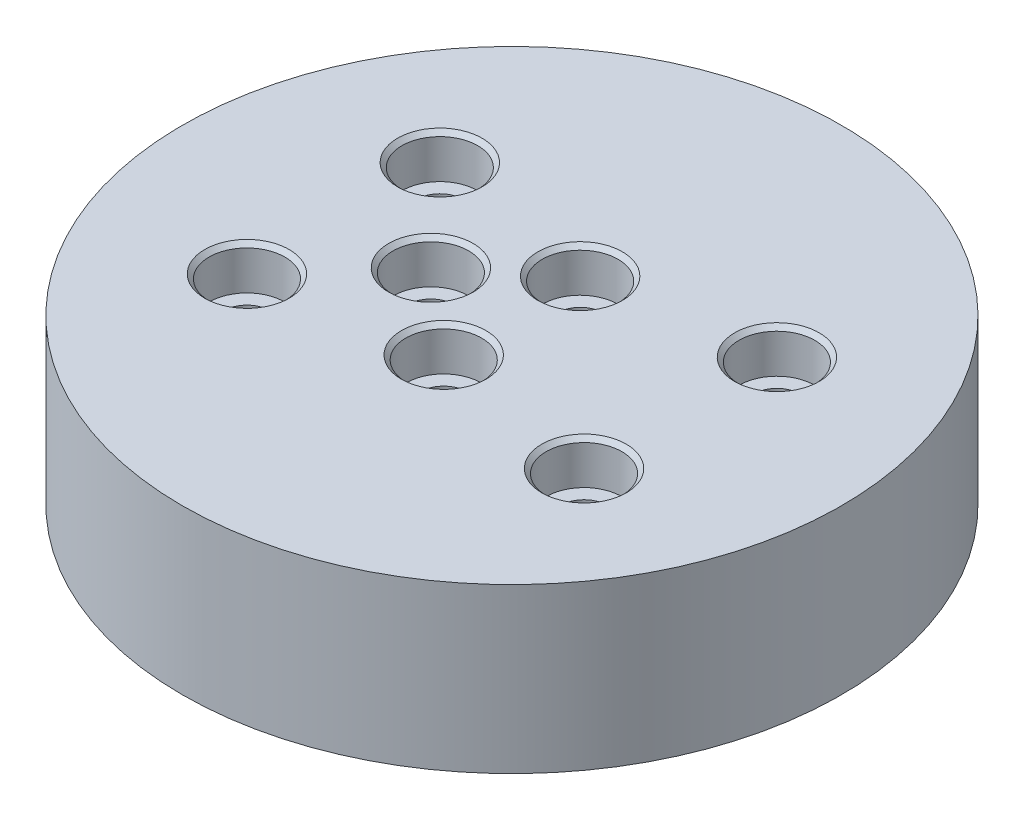
ISO-10303-21;
HEADER;
FILE_DESCRIPTION(('STEP AP214'),'2;1');
FILE_NAME('part.step','',(''),(''),'','','');
FILE_SCHEMA(('AUTOMOTIVE_DESIGN { 1 0 10303 214 1 1 1 1 }'));
ENDSEC;
DATA;
#1=APPLICATION_CONTEXT('core data for automotive mechanical design processes');
#2=APPLICATION_PROTOCOL_DEFINITION('international standard','automotive_design',2000,#1);
#3=PRODUCT_CONTEXT('',#1,'mechanical');
#4=PRODUCT('Part','Part','',(#3));
#5=PRODUCT_RELATED_PRODUCT_CATEGORY('part','',(#4));
#6=PRODUCT_DEFINITION_FORMATION('','',#4);
#7=PRODUCT_DEFINITION_CONTEXT('part definition',#1,'design');
#8=PRODUCT_DEFINITION('design','',#6,#7);
#9=PRODUCT_DEFINITION_SHAPE('','',#8);
#10=(LENGTH_UNIT() NAMED_UNIT(*) SI_UNIT(.MILLI.,.METRE.));
#11=(NAMED_UNIT(*) PLANE_ANGLE_UNIT() SI_UNIT($,.RADIAN.));
#12=(NAMED_UNIT(*) SI_UNIT($,.STERADIAN.) SOLID_ANGLE_UNIT());
#13=UNCERTAINTY_MEASURE_WITH_UNIT(LENGTH_MEASURE(1.E-05),#10,'distance_accuracy_value','');
#14=(GEOMETRIC_REPRESENTATION_CONTEXT(3) GLOBAL_UNCERTAINTY_ASSIGNED_CONTEXT((#13)) GLOBAL_UNIT_ASSIGNED_CONTEXT((#10,
#11,#12)) REPRESENTATION_CONTEXT('',''));
#15=CARTESIAN_POINT('',(0.,0.,0.));
#16=DIRECTION('',(0.,0.,1.));
#17=DIRECTION('',(1.,0.,0.));
#18=AXIS2_PLACEMENT_3D('',#15,#16,#17);
#19=CARTESIAN_POINT('',(0.,24.,0.));
#20=DIRECTION('',(0.,-1.,0.));
#21=DIRECTION('',(0.,0.,-1.));
#22=AXIS2_PLACEMENT_3D('',#19,#20,#21);
#23=CYLINDRICAL_SURFACE('',#22,48.3128047327164);
#24=CARTESIAN_POINT('',(0.,24.,0.));
#25=DIRECTION('',(0.,1.,0.));
#26=DIRECTION('',(0.,0.,1.));
#27=AXIS2_PLACEMENT_3D('',#24,#25,#26);
#28=CIRCLE('',#27,48.3128047327164);
#29=CARTESIAN_POINT('',(0.,24.,48.3128047327164));
#30=VERTEX_POINT('',#29);
#31=EDGE_CURVE('E10',#30,#30,#28,.T.);
#32=ORIENTED_EDGE('',*,*,#31,.F.);
#33=EDGE_LOOP('',(#32));
#34=FACE_BOUND('',#33,.T.);
#35=CARTESIAN_POINT('',(0.,0.,0.));
#36=DIRECTION('',(0.,1.,0.));
#37=DIRECTION('',(0.,0.,1.));
#38=AXIS2_PLACEMENT_3D('',#35,#36,#37);
#39=CIRCLE('',#38,48.3128047327164);
#40=CARTESIAN_POINT('',(0.,0.,48.3128047327164));
#41=VERTEX_POINT('',#40);
#42=EDGE_CURVE('E34',#41,#41,#39,.T.);
#43=ORIENTED_EDGE('',*,*,#42,.T.);
#44=EDGE_LOOP('',(#43));
#45=FACE_BOUND('',#44,.T.);
#46=ADVANCED_FACE('F31',(#34,#45),#23,.T.);
#47=CARTESIAN_POINT('',(0.,24.,0.));
#48=DIRECTION('',(0.,1.,0.));
#49=DIRECTION('',(0.,0.,1.));
#50=AXIS2_PLACEMENT_3D('',#47,#48,#49);
#51=PLANE('',#50);
#52=CARTESIAN_POINT('',(0.,24.,10.));
#53=DIRECTION('',(0.,1.,0.));
#54=DIRECTION('',(0.,0.,1.));
#55=AXIS2_PLACEMENT_3D('',#52,#53,#54);
#56=CIRCLE('',#55,6.19125);
#57=CARTESIAN_POINT('',(0.,24.,16.19125));
#58=VERTEX_POINT('',#57);
#59=EDGE_CURVE('E144',#58,#58,#56,.T.);
#60=ORIENTED_EDGE('',*,*,#59,.F.);
#61=EDGE_LOOP('',(#60));
#62=FACE_BOUND('',#61,.T.);
#63=CARTESIAN_POINT('',(-24.7068324205673,24.,14.1367177629493));
#64=DIRECTION('',(0.,1.,0.));
#65=DIRECTION('',(0.,0.,1.));
#66=AXIS2_PLACEMENT_3D('',#63,#64,#65);
#67=CIRCLE('',#66,6.19125);
#68=CARTESIAN_POINT('',(-24.7068324205673,24.,20.3279677629493));
#69=VERTEX_POINT('',#68);
#70=EDGE_CURVE('E129',#69,#69,#67,.T.);
#71=ORIENTED_EDGE('',*,*,#70,.F.);
#72=EDGE_LOOP('',(#71));
#73=FACE_BOUND('',#72,.T.);
#74=CARTESIAN_POINT('',(-24.7068324205673,24.,-14.1367177629493));
#75=DIRECTION('',(0.,1.,0.));
#76=DIRECTION('',(0.,0.,1.));
#77=AXIS2_PLACEMENT_3D('',#74,#75,#76);
#78=CIRCLE('',#77,6.19125);
#79=CARTESIAN_POINT('',(-24.7068324205673,24.,-7.94546776294935));
#80=VERTEX_POINT('',#79);
#81=EDGE_CURVE('E114',#80,#80,#78,.T.);
#82=ORIENTED_EDGE('',*,*,#81,.F.);
#83=EDGE_LOOP('',(#82));
#84=FACE_BOUND('',#83,.T.);
#85=CARTESIAN_POINT('',(24.7068324205673,24.,-14.1367177629493));
#86=DIRECTION('',(0.,1.,0.));
#87=DIRECTION('',(0.,0.,1.));
#88=AXIS2_PLACEMENT_3D('',#85,#86,#87);
#89=CIRCLE('',#88,6.19125);
#90=CARTESIAN_POINT('',(24.7068324205673,24.,-7.94546776294935));
#91=VERTEX_POINT('',#90);
#92=EDGE_CURVE('E99',#91,#91,#89,.T.);
#93=ORIENTED_EDGE('',*,*,#92,.F.);
#94=EDGE_LOOP('',(#93));
#95=FACE_BOUND('',#94,.T.);
#96=CARTESIAN_POINT('',(0.,24.,-10.));
#97=DIRECTION('',(0.,1.,0.));
#98=DIRECTION('',(0.,0.,1.));
#99=AXIS2_PLACEMENT_3D('',#96,#97,#98);
#100=CIRCLE('',#99,6.19125);
#101=CARTESIAN_POINT('',(0.,24.,-3.80875));
#102=VERTEX_POINT('',#101);
#103=EDGE_CURVE('E84',#102,#102,#100,.T.);
#104=ORIENTED_EDGE('',*,*,#103,.F.);
#105=EDGE_LOOP('',(#104));
#106=FACE_BOUND('',#105,.T.);
#107=CARTESIAN_POINT('',(24.7068324205673,24.,14.1367177629493));
#108=DIRECTION('',(0.,1.,0.));
#109=DIRECTION('',(0.,0.,1.));
#110=AXIS2_PLACEMENT_3D('',#107,#108,#109);
#111=CIRCLE('',#110,6.19125);
#112=CARTESIAN_POINT('',(24.7068324205673,24.,20.3279677629493));
#113=VERTEX_POINT('',#112);
#114=EDGE_CURVE('E69',#113,#113,#111,.T.);
#115=ORIENTED_EDGE('',*,*,#114,.F.);
#116=EDGE_LOOP('',(#115));
#117=FACE_BOUND('',#116,.T.);
#118=CARTESIAN_POINT('',(-12.,24.,-0.121142117749606));
#119=DIRECTION('',(0.,1.,0.));
#120=DIRECTION('',(0.,0.,1.));
#121=AXIS2_PLACEMENT_3D('',#118,#119,#120);
#122=CIRCLE('',#121,6.19125);
#123=CARTESIAN_POINT('',(-12.,24.,6.07010788225039));
#124=VERTEX_POINT('',#123);
#125=EDGE_CURVE('E54',#124,#124,#122,.T.);
#126=ORIENTED_EDGE('',*,*,#125,.F.);
#127=EDGE_LOOP('',(#126));
#128=FACE_BOUND('',#127,.T.);
#129=ORIENTED_EDGE('',*,*,#31,.T.);
#130=EDGE_LOOP('',(#129));
#131=FACE_BOUND('',#130,.T.);
#132=ADVANCED_FACE('F150',(#62,#73,#84,#95,#106,#117,#128,#131),#51,.T.);
#133=CARTESIAN_POINT('',(0.,0.,0.));
#134=DIRECTION('',(0.,1.,0.));
#135=DIRECTION('',(0.,0.,1.));
#136=AXIS2_PLACEMENT_3D('',#133,#134,#135);
#137=PLANE('',#136);
#138=CARTESIAN_POINT('',(0.,0.,10.));
#139=DIRECTION('',(0.,1.,0.));
#140=DIRECTION('',(0.,0.,1.));
#141=AXIS2_PLACEMENT_3D('',#138,#139,#140);
#142=CIRCLE('',#141,3.3782);
#143=CARTESIAN_POINT('',(0.,0.,13.3782));
#144=VERTEX_POINT('',#143);
#145=EDGE_CURVE('E132',#144,#144,#142,.T.);
#146=ORIENTED_EDGE('',*,*,#145,.T.);
#147=EDGE_LOOP('',(#146));
#148=FACE_BOUND('',#147,.T.);
#149=CARTESIAN_POINT('',(-24.7068324205673,0.,14.1367177629493));
#150=DIRECTION('',(0.,1.,0.));
#151=DIRECTION('',(0.,0.,1.));
#152=AXIS2_PLACEMENT_3D('',#149,#150,#151);
#153=CIRCLE('',#152,3.3782);
#154=CARTESIAN_POINT('',(-24.7068324205673,0.,17.5149177629493));
#155=VERTEX_POINT('',#154);
#156=EDGE_CURVE('E117',#155,#155,#153,.T.);
#157=ORIENTED_EDGE('',*,*,#156,.T.);
#158=EDGE_LOOP('',(#157));
#159=FACE_BOUND('',#158,.T.);
#160=CARTESIAN_POINT('',(-24.7068324205673,0.,-14.1367177629493));
#161=DIRECTION('',(0.,1.,0.));
#162=DIRECTION('',(0.,0.,1.));
#163=AXIS2_PLACEMENT_3D('',#160,#161,#162);
#164=CIRCLE('',#163,3.3782);
#165=CARTESIAN_POINT('',(-24.7068324205673,0.,-10.7585177629494));
#166=VERTEX_POINT('',#165);
#167=EDGE_CURVE('E102',#166,#166,#164,.T.);
#168=ORIENTED_EDGE('',*,*,#167,.T.);
#169=EDGE_LOOP('',(#168));
#170=FACE_BOUND('',#169,.T.);
#171=CARTESIAN_POINT('',(24.7068324205673,0.,-14.1367177629493));
#172=DIRECTION('',(0.,1.,0.));
#173=DIRECTION('',(0.,0.,1.));
#174=AXIS2_PLACEMENT_3D('',#171,#172,#173);
#175=CIRCLE('',#174,3.3782);
#176=CARTESIAN_POINT('',(24.7068324205673,0.,-10.7585177629494));
#177=VERTEX_POINT('',#176);
#178=EDGE_CURVE('E87',#177,#177,#175,.T.);
#179=ORIENTED_EDGE('',*,*,#178,.T.);
#180=EDGE_LOOP('',(#179));
#181=FACE_BOUND('',#180,.T.);
#182=CARTESIAN_POINT('',(0.,0.,-10.));
#183=DIRECTION('',(0.,1.,0.));
#184=DIRECTION('',(0.,0.,1.));
#185=AXIS2_PLACEMENT_3D('',#182,#183,#184);
#186=CIRCLE('',#185,3.3782);
#187=CARTESIAN_POINT('',(0.,0.,-6.62180000000001));
#188=VERTEX_POINT('',#187);
#189=EDGE_CURVE('E72',#188,#188,#186,.T.);
#190=ORIENTED_EDGE('',*,*,#189,.T.);
#191=EDGE_LOOP('',(#190));
#192=FACE_BOUND('',#191,.T.);
#193=CARTESIAN_POINT('',(24.7068324205673,0.,14.1367177629493));
#194=DIRECTION('',(0.,1.,0.));
#195=DIRECTION('',(0.,0.,1.));
#196=AXIS2_PLACEMENT_3D('',#193,#194,#195);
#197=CIRCLE('',#196,3.3782);
#198=CARTESIAN_POINT('',(24.7068324205673,0.,17.5149177629493));
#199=VERTEX_POINT('',#198);
#200=EDGE_CURVE('E57',#199,#199,#197,.T.);
#201=ORIENTED_EDGE('',*,*,#200,.T.);
#202=EDGE_LOOP('',(#201));
#203=FACE_BOUND('',#202,.T.);
#204=CARTESIAN_POINT('',(-12.,0.,-0.121142117749606));
#205=DIRECTION('',(0.,1.,0.));
#206=DIRECTION('',(0.,0.,1.));
#207=AXIS2_PLACEMENT_3D('',#204,#205,#206);
#208=CIRCLE('',#207,3.3782);
#209=CARTESIAN_POINT('',(-12.,0.,3.25705788225039));
#210=VERTEX_POINT('',#209);
#211=EDGE_CURVE('E41',#210,#210,#208,.T.);
#212=ORIENTED_EDGE('',*,*,#211,.T.);
#213=EDGE_LOOP('',(#212));
#214=FACE_BOUND('',#213,.T.);
#215=ORIENTED_EDGE('',*,*,#42,.F.);
#216=EDGE_LOOP('',(#215));
#217=FACE_BOUND('',#216,.T.);
#218=ADVANCED_FACE('F153',(#148,#159,#170,#181,#192,#203,#214,#217),#137,.F.);
#219=CARTESIAN_POINT('',(-12.,24.,-0.121142117749606));
#220=DIRECTION('',(0.,1.,0.));
#221=DIRECTION('',(0.,0.,1.));
#222=AXIS2_PLACEMENT_3D('',#219,#220,#221);
#223=CYLINDRICAL_SURFACE('',#222,3.3782);
#224=ORIENTED_EDGE('',*,*,#211,.F.);
#225=EDGE_LOOP('',(#224));
#226=FACE_BOUND('',#225,.T.);
#227=CARTESIAN_POINT('',(-12.,17.65,-0.121142117749606));
#228=DIRECTION('',(0.,1.,0.));
#229=DIRECTION('',(0.,0.,1.));
#230=AXIS2_PLACEMENT_3D('',#227,#228,#229);
#231=CIRCLE('',#230,3.3782);
#232=CARTESIAN_POINT('',(-12.,17.65,3.25705788225039));
#233=VERTEX_POINT('',#232);
#234=EDGE_CURVE('E45',#233,#233,#231,.T.);
#235=ORIENTED_EDGE('',*,*,#234,.T.);
#236=EDGE_LOOP('',(#235));
#237=FACE_BOUND('',#236,.T.);
#238=ADVANCED_FACE('F193',(#226,#237),#223,.F.);
#239=CARTESIAN_POINT('',(-6.44375,17.65,-0.121142117749606));
#240=DIRECTION('',(0.,-1.,0.));
#241=DIRECTION('',(0.,0.,-1.));
#242=AXIS2_PLACEMENT_3D('',#239,#240,#241);
#243=PLANE('',#242);
#244=ORIENTED_EDGE('',*,*,#234,.F.);
#245=EDGE_LOOP('',(#244));
#246=FACE_BOUND('',#245,.T.);
#247=CARTESIAN_POINT('',(-12.,17.65,-0.121142117749606));
#248=DIRECTION('',(0.,1.,0.));
#249=DIRECTION('',(0.,0.,1.));
#250=AXIS2_PLACEMENT_3D('',#247,#248,#249);
#251=CIRCLE('',#250,5.55625);
#252=CARTESIAN_POINT('',(-12.,17.65,5.43510788225039));
#253=VERTEX_POINT('',#252);
#254=EDGE_CURVE('E48',#253,#253,#251,.T.);
#255=ORIENTED_EDGE('',*,*,#254,.T.);
#256=EDGE_LOOP('',(#255));
#257=FACE_BOUND('',#256,.T.);
#258=ADVANCED_FACE('F180',(#246,#257),#243,.F.);
#259=CARTESIAN_POINT('',(-12.,24.,-0.121142117749606));
#260=DIRECTION('',(0.,1.,0.));
#261=DIRECTION('',(0.,0.,1.));
#262=AXIS2_PLACEMENT_3D('',#259,#260,#261);
#263=CYLINDRICAL_SURFACE('',#262,5.55625);
#264=ORIENTED_EDGE('',*,*,#254,.F.);
#265=EDGE_LOOP('',(#264));
#266=FACE_BOUND('',#265,.T.);
#267=CARTESIAN_POINT('',(-12.,23.365,-0.121142117749606));
#268=DIRECTION('',(0.,1.,0.));
#269=DIRECTION('',(0.,0.,1.));
#270=AXIS2_PLACEMENT_3D('',#267,#268,#269);
#271=CIRCLE('',#270,5.55625);
#272=CARTESIAN_POINT('',(-12.,23.365,5.43510788225039));
#273=VERTEX_POINT('',#272);
#274=EDGE_CURVE('E51',#273,#273,#271,.T.);
#275=ORIENTED_EDGE('',*,*,#274,.T.);
#276=EDGE_LOOP('',(#275));
#277=FACE_BOUND('',#276,.T.);
#278=ADVANCED_FACE('F170',(#266,#277),#263,.F.);
#279=CARTESIAN_POINT('',(-12.,24.,-0.121142117749606));
#280=DIRECTION('',(0.,1.,0.));
#281=DIRECTION('',(0.,0.,1.));
#282=AXIS2_PLACEMENT_3D('',#279,#280,#281);
#283=CONICAL_SURFACE('',#282,6.19125,0.785398163397448);
#284=ORIENTED_EDGE('',*,*,#274,.F.);
#285=EDGE_LOOP('',(#284));
#286=FACE_BOUND('',#285,.T.);
#287=ORIENTED_EDGE('',*,*,#125,.T.);
#288=EDGE_LOOP('',(#287));
#289=FACE_BOUND('',#288,.T.);
#290=ADVANCED_FACE('F167',(#286,#289),#283,.F.);
#291=CARTESIAN_POINT('',(24.7068324205673,24.,14.1367177629493));
#292=DIRECTION('',(0.,1.,0.));
#293=DIRECTION('',(0.,0.,1.));
#294=AXIS2_PLACEMENT_3D('',#291,#292,#293);
#295=CYLINDRICAL_SURFACE('',#294,3.3782);
#296=ORIENTED_EDGE('',*,*,#200,.F.);
#297=EDGE_LOOP('',(#296));
#298=FACE_BOUND('',#297,.T.);
#299=CARTESIAN_POINT('',(24.7068324205673,17.65,14.1367177629493));
#300=DIRECTION('',(0.,1.,0.));
#301=DIRECTION('',(0.,0.,1.));
#302=AXIS2_PLACEMENT_3D('',#299,#300,#301);
#303=CIRCLE('',#302,3.3782);
#304=CARTESIAN_POINT('',(24.7068324205673,17.65,17.5149177629493));
#305=VERTEX_POINT('',#304);
#306=EDGE_CURVE('E60',#305,#305,#303,.T.);
#307=ORIENTED_EDGE('',*,*,#306,.T.);
#308=EDGE_LOOP('',(#307));
#309=FACE_BOUND('',#308,.T.);
#310=ADVANCED_FACE('F169',(#298,#309),#295,.F.);
#311=CARTESIAN_POINT('',(30.2630824205673,17.65,14.1367177629493));
#312=DIRECTION('',(0.,-1.,0.));
#313=DIRECTION('',(0.,0.,-1.));
#314=AXIS2_PLACEMENT_3D('',#311,#312,#313);
#315=PLANE('',#314);
#316=ORIENTED_EDGE('',*,*,#306,.F.);
#317=EDGE_LOOP('',(#316));
#318=FACE_BOUND('',#317,.T.);
#319=CARTESIAN_POINT('',(24.7068324205673,17.65,14.1367177629493));
#320=DIRECTION('',(0.,1.,0.));
#321=DIRECTION('',(0.,0.,1.));
#322=AXIS2_PLACEMENT_3D('',#319,#320,#321);
#323=CIRCLE('',#322,5.55625);
#324=CARTESIAN_POINT('',(24.7068324205673,17.65,19.6929677629493));
#325=VERTEX_POINT('',#324);
#326=EDGE_CURVE('E63',#325,#325,#323,.T.);
#327=ORIENTED_EDGE('',*,*,#326,.T.);
#328=EDGE_LOOP('',(#327));
#329=FACE_BOUND('',#328,.T.);
#330=ADVANCED_FACE('F177',(#318,#329),#315,.F.);
#331=CARTESIAN_POINT('',(24.7068324205673,24.,14.1367177629493));
#332=DIRECTION('',(0.,1.,0.));
#333=DIRECTION('',(0.,0.,1.));
#334=AXIS2_PLACEMENT_3D('',#331,#332,#333);
#335=CYLINDRICAL_SURFACE('',#334,5.55625);
#336=ORIENTED_EDGE('',*,*,#326,.F.);
#337=EDGE_LOOP('',(#336));
#338=FACE_BOUND('',#337,.T.);
#339=CARTESIAN_POINT('',(24.7068324205673,23.365,14.1367177629493));
#340=DIRECTION('',(0.,1.,0.));
#341=DIRECTION('',(0.,0.,1.));
#342=AXIS2_PLACEMENT_3D('',#339,#340,#341);
#343=CIRCLE('',#342,5.55625);
#344=CARTESIAN_POINT('',(24.7068324205673,23.365,19.6929677629493));
#345=VERTEX_POINT('',#344);
#346=EDGE_CURVE('E66',#345,#345,#343,.T.);
#347=ORIENTED_EDGE('',*,*,#346,.T.);
#348=EDGE_LOOP('',(#347));
#349=FACE_BOUND('',#348,.T.);
#350=ADVANCED_FACE('F236',(#338,#349),#335,.F.);
#351=CARTESIAN_POINT('',(24.7068324205673,24.,14.1367177629493));
#352=DIRECTION('',(0.,1.,0.));
#353=DIRECTION('',(0.,0.,1.));
#354=AXIS2_PLACEMENT_3D('',#351,#352,#353);
#355=CONICAL_SURFACE('',#354,6.19125,0.785398163397448);
#356=ORIENTED_EDGE('',*,*,#346,.F.);
#357=EDGE_LOOP('',(#356));
#358=FACE_BOUND('',#357,.T.);
#359=ORIENTED_EDGE('',*,*,#114,.T.);
#360=EDGE_LOOP('',(#359));
#361=FACE_BOUND('',#360,.T.);
#362=ADVANCED_FACE('F246',(#358,#361),#355,.F.);
#363=CARTESIAN_POINT('',(0.,24.,-10.));
#364=DIRECTION('',(0.,1.,0.));
#365=DIRECTION('',(0.,0.,1.));
#366=AXIS2_PLACEMENT_3D('',#363,#364,#365);
#367=CYLINDRICAL_SURFACE('',#366,3.3782);
#368=ORIENTED_EDGE('',*,*,#189,.F.);
#369=EDGE_LOOP('',(#368));
#370=FACE_BOUND('',#369,.T.);
#371=CARTESIAN_POINT('',(0.,17.65,-10.));
#372=DIRECTION('',(0.,1.,0.));
#373=DIRECTION('',(0.,0.,1.));
#374=AXIS2_PLACEMENT_3D('',#371,#372,#373);
#375=CIRCLE('',#374,3.3782);
#376=CARTESIAN_POINT('',(0.,17.65,-6.6218));
#377=VERTEX_POINT('',#376);
#378=EDGE_CURVE('E75',#377,#377,#375,.T.);
#379=ORIENTED_EDGE('',*,*,#378,.T.);
#380=EDGE_LOOP('',(#379));
#381=FACE_BOUND('',#380,.T.);
#382=ADVANCED_FACE('F256',(#370,#381),#367,.F.);
#383=CARTESIAN_POINT('',(5.55625,17.65,-10.));
#384=DIRECTION('',(0.,-1.,0.));
#385=DIRECTION('',(0.,0.,-1.));
#386=AXIS2_PLACEMENT_3D('',#383,#384,#385);
#387=PLANE('',#386);
#388=ORIENTED_EDGE('',*,*,#378,.F.);
#389=EDGE_LOOP('',(#388));
#390=FACE_BOUND('',#389,.T.);
#391=CARTESIAN_POINT('',(0.,17.65,-10.));
#392=DIRECTION('',(0.,1.,0.));
#393=DIRECTION('',(0.,0.,1.));
#394=AXIS2_PLACEMENT_3D('',#391,#392,#393);
#395=CIRCLE('',#394,5.55625);
#396=CARTESIAN_POINT('',(0.,17.65,-4.44375));
#397=VERTEX_POINT('',#396);
#398=EDGE_CURVE('E78',#397,#397,#395,.T.);
#399=ORIENTED_EDGE('',*,*,#398,.T.);
#400=EDGE_LOOP('',(#399));
#401=FACE_BOUND('',#400,.T.);
#402=ADVANCED_FACE('F266',(#390,#401),#387,.F.);
#403=CARTESIAN_POINT('',(0.,24.,-10.));
#404=DIRECTION('',(0.,1.,0.));
#405=DIRECTION('',(0.,0.,1.));
#406=AXIS2_PLACEMENT_3D('',#403,#404,#405);
#407=CYLINDRICAL_SURFACE('',#406,5.55625);
#408=ORIENTED_EDGE('',*,*,#398,.F.);
#409=EDGE_LOOP('',(#408));
#410=FACE_BOUND('',#409,.T.);
#411=CARTESIAN_POINT('',(0.,23.365,-10.));
#412=DIRECTION('',(0.,1.,0.));
#413=DIRECTION('',(0.,0.,1.));
#414=AXIS2_PLACEMENT_3D('',#411,#412,#413);
#415=CIRCLE('',#414,5.55625);
#416=CARTESIAN_POINT('',(0.,23.365,-4.44375));
#417=VERTEX_POINT('',#416);
#418=EDGE_CURVE('E81',#417,#417,#415,.T.);
#419=ORIENTED_EDGE('',*,*,#418,.T.);
#420=EDGE_LOOP('',(#419));
#421=FACE_BOUND('',#420,.T.);
#422=ADVANCED_FACE('F276',(#410,#421),#407,.F.);
#423=CARTESIAN_POINT('',(0.,24.,-10.));
#424=DIRECTION('',(0.,1.,0.));
#425=DIRECTION('',(0.,0.,1.));
#426=AXIS2_PLACEMENT_3D('',#423,#424,#425);
#427=CONICAL_SURFACE('',#426,6.19125,0.785398163397448);
#428=ORIENTED_EDGE('',*,*,#418,.F.);
#429=EDGE_LOOP('',(#428));
#430=FACE_BOUND('',#429,.T.);
#431=ORIENTED_EDGE('',*,*,#103,.T.);
#432=EDGE_LOOP('',(#431));
#433=FACE_BOUND('',#432,.T.);
#434=ADVANCED_FACE('F286',(#430,#433),#427,.F.);
#435=CARTESIAN_POINT('',(24.7068324205673,24.,-14.1367177629493));
#436=DIRECTION('',(0.,1.,0.));
#437=DIRECTION('',(0.,0.,1.));
#438=AXIS2_PLACEMENT_3D('',#435,#436,#437);
#439=CYLINDRICAL_SURFACE('',#438,3.3782);
#440=ORIENTED_EDGE('',*,*,#178,.F.);
#441=EDGE_LOOP('',(#440));
#442=FACE_BOUND('',#441,.T.);
#443=CARTESIAN_POINT('',(24.7068324205673,17.65,-14.1367177629493));
#444=DIRECTION('',(0.,1.,0.));
#445=DIRECTION('',(0.,0.,1.));
#446=AXIS2_PLACEMENT_3D('',#443,#444,#445);
#447=CIRCLE('',#446,3.3782);
#448=CARTESIAN_POINT('',(24.7068324205673,17.65,-10.7585177629494));
#449=VERTEX_POINT('',#448);
#450=EDGE_CURVE('E90',#449,#449,#447,.T.);
#451=ORIENTED_EDGE('',*,*,#450,.T.);
#452=EDGE_LOOP('',(#451));
#453=FACE_BOUND('',#452,.T.);
#454=ADVANCED_FACE('F296',(#442,#453),#439,.F.);
#455=CARTESIAN_POINT('',(30.2630824205673,17.65,-14.1367177629493));
#456=DIRECTION('',(0.,-1.,0.));
#457=DIRECTION('',(0.,0.,-1.));
#458=AXIS2_PLACEMENT_3D('',#455,#456,#457);
#459=PLANE('',#458);
#460=ORIENTED_EDGE('',*,*,#450,.F.);
#461=EDGE_LOOP('',(#460));
#462=FACE_BOUND('',#461,.T.);
#463=CARTESIAN_POINT('',(24.7068324205673,17.65,-14.1367177629493));
#464=DIRECTION('',(0.,1.,0.));
#465=DIRECTION('',(0.,0.,1.));
#466=AXIS2_PLACEMENT_3D('',#463,#464,#465);
#467=CIRCLE('',#466,5.55625);
#468=CARTESIAN_POINT('',(24.7068324205673,17.65,-8.58046776294935));
#469=VERTEX_POINT('',#468);
#470=EDGE_CURVE('E93',#469,#469,#467,.T.);
#471=ORIENTED_EDGE('',*,*,#470,.T.);
#472=EDGE_LOOP('',(#471));
#473=FACE_BOUND('',#472,.T.);
#474=ADVANCED_FACE('F306',(#462,#473),#459,.F.);
#475=CARTESIAN_POINT('',(24.7068324205673,24.,-14.1367177629493));
#476=DIRECTION('',(0.,1.,0.));
#477=DIRECTION('',(0.,0.,1.));
#478=AXIS2_PLACEMENT_3D('',#475,#476,#477);
#479=CYLINDRICAL_SURFACE('',#478,5.55625);
#480=ORIENTED_EDGE('',*,*,#470,.F.);
#481=EDGE_LOOP('',(#480));
#482=FACE_BOUND('',#481,.T.);
#483=CARTESIAN_POINT('',(24.7068324205673,23.365,-14.1367177629493));
#484=DIRECTION('',(0.,1.,0.));
#485=DIRECTION('',(0.,0.,1.));
#486=AXIS2_PLACEMENT_3D('',#483,#484,#485);
#487=CIRCLE('',#486,5.55625);
#488=CARTESIAN_POINT('',(24.7068324205673,23.365,-8.58046776294935));
#489=VERTEX_POINT('',#488);
#490=EDGE_CURVE('E96',#489,#489,#487,.T.);
#491=ORIENTED_EDGE('',*,*,#490,.T.);
#492=EDGE_LOOP('',(#491));
#493=FACE_BOUND('',#492,.T.);
#494=ADVANCED_FACE('F316',(#482,#493),#479,.F.);
#495=CARTESIAN_POINT('',(24.7068324205673,24.,-14.1367177629493));
#496=DIRECTION('',(0.,1.,0.));
#497=DIRECTION('',(0.,0.,1.));
#498=AXIS2_PLACEMENT_3D('',#495,#496,#497);
#499=CONICAL_SURFACE('',#498,6.19125,0.785398163397448);
#500=ORIENTED_EDGE('',*,*,#490,.F.);
#501=EDGE_LOOP('',(#500));
#502=FACE_BOUND('',#501,.T.);
#503=ORIENTED_EDGE('',*,*,#92,.T.);
#504=EDGE_LOOP('',(#503));
#505=FACE_BOUND('',#504,.T.);
#506=ADVANCED_FACE('F326',(#502,#505),#499,.F.);
#507=CARTESIAN_POINT('',(-24.7068324205673,24.,-14.1367177629493));
#508=DIRECTION('',(0.,1.,0.));
#509=DIRECTION('',(0.,0.,1.));
#510=AXIS2_PLACEMENT_3D('',#507,#508,#509);
#511=CYLINDRICAL_SURFACE('',#510,3.3782);
#512=ORIENTED_EDGE('',*,*,#167,.F.);
#513=EDGE_LOOP('',(#512));
#514=FACE_BOUND('',#513,.T.);
#515=CARTESIAN_POINT('',(-24.7068324205673,17.65,-14.1367177629493));
#516=DIRECTION('',(0.,1.,0.));
#517=DIRECTION('',(0.,0.,1.));
#518=AXIS2_PLACEMENT_3D('',#515,#516,#517);
#519=CIRCLE('',#518,3.3782);
#520=CARTESIAN_POINT('',(-24.7068324205673,17.65,-10.7585177629494));
#521=VERTEX_POINT('',#520);
#522=EDGE_CURVE('E105',#521,#521,#519,.T.);
#523=ORIENTED_EDGE('',*,*,#522,.T.);
#524=EDGE_LOOP('',(#523));
#525=FACE_BOUND('',#524,.T.);
#526=ADVANCED_FACE('F336',(#514,#525),#511,.F.);
#527=CARTESIAN_POINT('',(-19.1505824205673,17.65,-14.1367177629493));
#528=DIRECTION('',(0.,-1.,0.));
#529=DIRECTION('',(0.,0.,-1.));
#530=AXIS2_PLACEMENT_3D('',#527,#528,#529);
#531=PLANE('',#530);
#532=ORIENTED_EDGE('',*,*,#522,.F.);
#533=EDGE_LOOP('',(#532));
#534=FACE_BOUND('',#533,.T.);
#535=CARTESIAN_POINT('',(-24.7068324205673,17.65,-14.1367177629493));
#536=DIRECTION('',(0.,1.,0.));
#537=DIRECTION('',(0.,0.,1.));
#538=AXIS2_PLACEMENT_3D('',#535,#536,#537);
#539=CIRCLE('',#538,5.55625);
#540=CARTESIAN_POINT('',(-24.7068324205673,17.65,-8.58046776294935));
#541=VERTEX_POINT('',#540);
#542=EDGE_CURVE('E108',#541,#541,#539,.T.);
#543=ORIENTED_EDGE('',*,*,#542,.T.);
#544=EDGE_LOOP('',(#543));
#545=FACE_BOUND('',#544,.T.);
#546=ADVANCED_FACE('F346',(#534,#545),#531,.F.);
#547=CARTESIAN_POINT('',(-24.7068324205673,24.,-14.1367177629493));
#548=DIRECTION('',(0.,1.,0.));
#549=DIRECTION('',(0.,0.,1.));
#550=AXIS2_PLACEMENT_3D('',#547,#548,#549);
#551=CYLINDRICAL_SURFACE('',#550,5.55625);
#552=ORIENTED_EDGE('',*,*,#542,.F.);
#553=EDGE_LOOP('',(#552));
#554=FACE_BOUND('',#553,.T.);
#555=CARTESIAN_POINT('',(-24.7068324205673,23.365,-14.1367177629493));
#556=DIRECTION('',(0.,1.,0.));
#557=DIRECTION('',(0.,0.,1.));
#558=AXIS2_PLACEMENT_3D('',#555,#556,#557);
#559=CIRCLE('',#558,5.55625);
#560=CARTESIAN_POINT('',(-24.7068324205673,23.365,-8.58046776294935));
#561=VERTEX_POINT('',#560);
#562=EDGE_CURVE('E111',#561,#561,#559,.T.);
#563=ORIENTED_EDGE('',*,*,#562,.T.);
#564=EDGE_LOOP('',(#563));
#565=FACE_BOUND('',#564,.T.);
#566=ADVANCED_FACE('F356',(#554,#565),#551,.F.);
#567=CARTESIAN_POINT('',(-24.7068324205673,24.,-14.1367177629493));
#568=DIRECTION('',(0.,1.,0.));
#569=DIRECTION('',(0.,0.,1.));
#570=AXIS2_PLACEMENT_3D('',#567,#568,#569);
#571=CONICAL_SURFACE('',#570,6.19125,0.785398163397448);
#572=ORIENTED_EDGE('',*,*,#562,.F.);
#573=EDGE_LOOP('',(#572));
#574=FACE_BOUND('',#573,.T.);
#575=ORIENTED_EDGE('',*,*,#81,.T.);
#576=EDGE_LOOP('',(#575));
#577=FACE_BOUND('',#576,.T.);
#578=ADVANCED_FACE('F366',(#574,#577),#571,.F.);
#579=CARTESIAN_POINT('',(-24.7068324205673,24.,14.1367177629493));
#580=DIRECTION('',(0.,1.,0.));
#581=DIRECTION('',(0.,0.,1.));
#582=AXIS2_PLACEMENT_3D('',#579,#580,#581);
#583=CYLINDRICAL_SURFACE('',#582,3.3782);
#584=ORIENTED_EDGE('',*,*,#156,.F.);
#585=EDGE_LOOP('',(#584));
#586=FACE_BOUND('',#585,.T.);
#587=CARTESIAN_POINT('',(-24.7068324205673,17.65,14.1367177629493));
#588=DIRECTION('',(0.,1.,0.));
#589=DIRECTION('',(0.,0.,1.));
#590=AXIS2_PLACEMENT_3D('',#587,#588,#589);
#591=CIRCLE('',#590,3.3782);
#592=CARTESIAN_POINT('',(-24.7068324205673,17.65,17.5149177629493));
#593=VERTEX_POINT('',#592);
#594=EDGE_CURVE('E120',#593,#593,#591,.T.);
#595=ORIENTED_EDGE('',*,*,#594,.T.);
#596=EDGE_LOOP('',(#595));
#597=FACE_BOUND('',#596,.T.);
#598=ADVANCED_FACE('F376',(#586,#597),#583,.F.);
#599=CARTESIAN_POINT('',(-19.1505824205673,17.65,14.1367177629493));
#600=DIRECTION('',(0.,-1.,0.));
#601=DIRECTION('',(0.,0.,-1.));
#602=AXIS2_PLACEMENT_3D('',#599,#600,#601);
#603=PLANE('',#602);
#604=ORIENTED_EDGE('',*,*,#594,.F.);
#605=EDGE_LOOP('',(#604));
#606=FACE_BOUND('',#605,.T.);
#607=CARTESIAN_POINT('',(-24.7068324205673,17.65,14.1367177629493));
#608=DIRECTION('',(0.,1.,0.));
#609=DIRECTION('',(0.,0.,1.));
#610=AXIS2_PLACEMENT_3D('',#607,#608,#609);
#611=CIRCLE('',#610,5.55625);
#612=CARTESIAN_POINT('',(-24.7068324205673,17.65,19.6929677629493));
#613=VERTEX_POINT('',#612);
#614=EDGE_CURVE('E123',#613,#613,#611,.T.);
#615=ORIENTED_EDGE('',*,*,#614,.T.);
#616=EDGE_LOOP('',(#615));
#617=FACE_BOUND('',#616,.T.);
#618=ADVANCED_FACE('F386',(#606,#617),#603,.F.);
#619=CARTESIAN_POINT('',(-24.7068324205673,24.,14.1367177629493));
#620=DIRECTION('',(0.,1.,0.));
#621=DIRECTION('',(0.,0.,1.));
#622=AXIS2_PLACEMENT_3D('',#619,#620,#621);
#623=CYLINDRICAL_SURFACE('',#622,5.55625);
#624=ORIENTED_EDGE('',*,*,#614,.F.);
#625=EDGE_LOOP('',(#624));
#626=FACE_BOUND('',#625,.T.);
#627=CARTESIAN_POINT('',(-24.7068324205673,23.365,14.1367177629493));
#628=DIRECTION('',(0.,1.,0.));
#629=DIRECTION('',(0.,0.,1.));
#630=AXIS2_PLACEMENT_3D('',#627,#628,#629);
#631=CIRCLE('',#630,5.55625);
#632=CARTESIAN_POINT('',(-24.7068324205673,23.365,19.6929677629493));
#633=VERTEX_POINT('',#632);
#634=EDGE_CURVE('E126',#633,#633,#631,.T.);
#635=ORIENTED_EDGE('',*,*,#634,.T.);
#636=EDGE_LOOP('',(#635));
#637=FACE_BOUND('',#636,.T.);
#638=ADVANCED_FACE('F396',(#626,#637),#623,.F.);
#639=CARTESIAN_POINT('',(-24.7068324205673,24.,14.1367177629493));
#640=DIRECTION('',(0.,1.,0.));
#641=DIRECTION('',(0.,0.,1.));
#642=AXIS2_PLACEMENT_3D('',#639,#640,#641);
#643=CONICAL_SURFACE('',#642,6.19125,0.785398163397448);
#644=ORIENTED_EDGE('',*,*,#634,.F.);
#645=EDGE_LOOP('',(#644));
#646=FACE_BOUND('',#645,.T.);
#647=ORIENTED_EDGE('',*,*,#70,.T.);
#648=EDGE_LOOP('',(#647));
#649=FACE_BOUND('',#648,.T.);
#650=ADVANCED_FACE('F406',(#646,#649),#643,.F.);
#651=CARTESIAN_POINT('',(0.,24.,10.));
#652=DIRECTION('',(0.,1.,0.));
#653=DIRECTION('',(0.,0.,1.));
#654=AXIS2_PLACEMENT_3D('',#651,#652,#653);
#655=CYLINDRICAL_SURFACE('',#654,3.3782);
#656=ORIENTED_EDGE('',*,*,#145,.F.);
#657=EDGE_LOOP('',(#656));
#658=FACE_BOUND('',#657,.T.);
#659=CARTESIAN_POINT('',(0.,17.65,10.));
#660=DIRECTION('',(0.,1.,0.));
#661=DIRECTION('',(0.,0.,1.));
#662=AXIS2_PLACEMENT_3D('',#659,#660,#661);
#663=CIRCLE('',#662,3.3782);
#664=CARTESIAN_POINT('',(0.,17.65,13.3782));
#665=VERTEX_POINT('',#664);
#666=EDGE_CURVE('E135',#665,#665,#663,.T.);
#667=ORIENTED_EDGE('',*,*,#666,.T.);
#668=EDGE_LOOP('',(#667));
#669=FACE_BOUND('',#668,.T.);
#670=ADVANCED_FACE('F416',(#658,#669),#655,.F.);
#671=CARTESIAN_POINT('',(5.55625,17.65,10.));
#672=DIRECTION('',(0.,-1.,0.));
#673=DIRECTION('',(0.,0.,-1.));
#674=AXIS2_PLACEMENT_3D('',#671,#672,#673);
#675=PLANE('',#674);
#676=ORIENTED_EDGE('',*,*,#666,.F.);
#677=EDGE_LOOP('',(#676));
#678=FACE_BOUND('',#677,.T.);
#679=CARTESIAN_POINT('',(0.,17.65,10.));
#680=DIRECTION('',(0.,1.,0.));
#681=DIRECTION('',(0.,0.,1.));
#682=AXIS2_PLACEMENT_3D('',#679,#680,#681);
#683=CIRCLE('',#682,5.55625);
#684=CARTESIAN_POINT('',(0.,17.65,15.55625));
#685=VERTEX_POINT('',#684);
#686=EDGE_CURVE('E138',#685,#685,#683,.T.);
#687=ORIENTED_EDGE('',*,*,#686,.T.);
#688=EDGE_LOOP('',(#687));
#689=FACE_BOUND('',#688,.T.);
#690=ADVANCED_FACE('F426',(#678,#689),#675,.F.);
#691=CARTESIAN_POINT('',(0.,24.,10.));
#692=DIRECTION('',(0.,1.,0.));
#693=DIRECTION('',(0.,0.,1.));
#694=AXIS2_PLACEMENT_3D('',#691,#692,#693);
#695=CYLINDRICAL_SURFACE('',#694,5.55625);
#696=ORIENTED_EDGE('',*,*,#686,.F.);
#697=EDGE_LOOP('',(#696));
#698=FACE_BOUND('',#697,.T.);
#699=CARTESIAN_POINT('',(0.,23.365,10.));
#700=DIRECTION('',(0.,1.,0.));
#701=DIRECTION('',(0.,0.,1.));
#702=AXIS2_PLACEMENT_3D('',#699,#700,#701);
#703=CIRCLE('',#702,5.55625);
#704=CARTESIAN_POINT('',(0.,23.365,15.55625));
#705=VERTEX_POINT('',#704);
#706=EDGE_CURVE('E141',#705,#705,#703,.T.);
#707=ORIENTED_EDGE('',*,*,#706,.T.);
#708=EDGE_LOOP('',(#707));
#709=FACE_BOUND('',#708,.T.);
#710=ADVANCED_FACE('F436',(#698,#709),#695,.F.);
#711=CARTESIAN_POINT('',(0.,24.,10.));
#712=DIRECTION('',(0.,1.,0.));
#713=DIRECTION('',(0.,0.,1.));
#714=AXIS2_PLACEMENT_3D('',#711,#712,#713);
#715=CONICAL_SURFACE('',#714,6.19125,0.785398163397448);
#716=ORIENTED_EDGE('',*,*,#706,.F.);
#717=EDGE_LOOP('',(#716));
#718=FACE_BOUND('',#717,.T.);
#719=ORIENTED_EDGE('',*,*,#59,.T.);
#720=EDGE_LOOP('',(#719));
#721=FACE_BOUND('',#720,.T.);
#722=ADVANCED_FACE('F148',(#718,#721),#715,.F.);
#723=CLOSED_SHELL('',(#46,#132,#218,#238,#258,#278,#290,#310,#330,#350,#362,#382,#402,#422,#434,
#454,#474,#494,#506,#526,#546,#566,#578,#598,#618,#638,#650,#670,#690,#710,#722));
#724=MANIFOLD_SOLID_BREP('B2',#723);
#725=ADVANCED_BREP_SHAPE_REPRESENTATION('',(#18,#724),#14);
#726=SHAPE_DEFINITION_REPRESENTATION(#9,#725);
ENDSEC;
END-ISO-10303-21;
